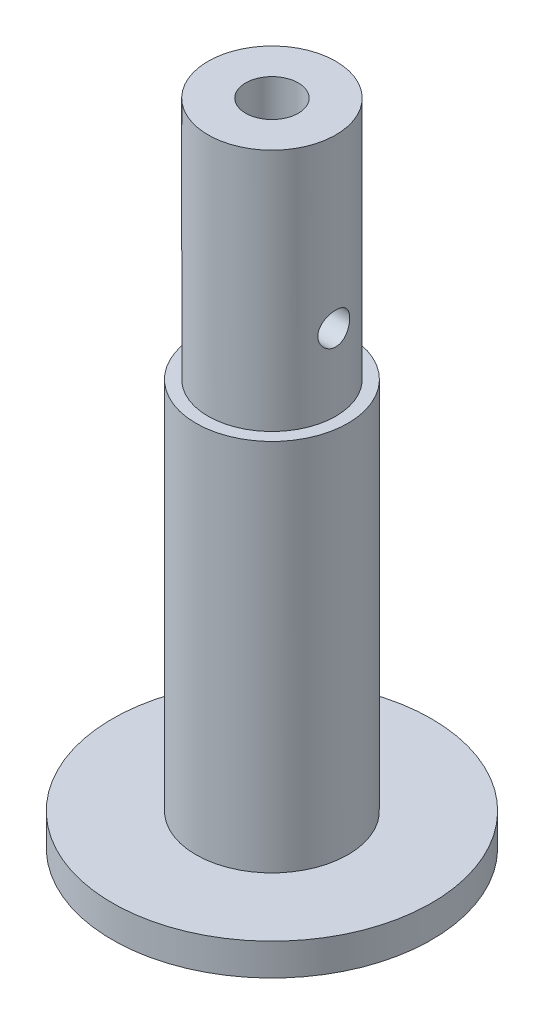
ISO-10303-21;
HEADER;
FILE_DESCRIPTION(('STEP AP214'),'2;1');
FILE_NAME('part.step','',(''),(''),'','','');
FILE_SCHEMA(('AUTOMOTIVE_DESIGN { 1 0 10303 214 1 1 1 1 }'));
ENDSEC;
DATA;
#1=APPLICATION_CONTEXT('core data for automotive mechanical design processes');
#2=APPLICATION_PROTOCOL_DEFINITION('international standard','automotive_design',2000,#1);
#3=PRODUCT_CONTEXT('',#1,'mechanical');
#4=PRODUCT('Part','Part','',(#3));
#5=PRODUCT_RELATED_PRODUCT_CATEGORY('part','',(#4));
#6=PRODUCT_DEFINITION_FORMATION('','',#4);
#7=PRODUCT_DEFINITION_CONTEXT('part definition',#1,'design');
#8=PRODUCT_DEFINITION('design','',#6,#7);
#9=PRODUCT_DEFINITION_SHAPE('','',#8);
#10=(LENGTH_UNIT() NAMED_UNIT(*) SI_UNIT(.MILLI.,.METRE.));
#11=(NAMED_UNIT(*) PLANE_ANGLE_UNIT() SI_UNIT($,.RADIAN.));
#12=(NAMED_UNIT(*) SI_UNIT($,.STERADIAN.) SOLID_ANGLE_UNIT());
#13=UNCERTAINTY_MEASURE_WITH_UNIT(LENGTH_MEASURE(1.E-05),#10,'distance_accuracy_value','');
#14=(GEOMETRIC_REPRESENTATION_CONTEXT(3) GLOBAL_UNCERTAINTY_ASSIGNED_CONTEXT((#13)) GLOBAL_UNIT_ASSIGNED_CONTEXT((#10,
#11,#12)) REPRESENTATION_CONTEXT('',''));
#15=CARTESIAN_POINT('',(0.,0.,0.));
#16=DIRECTION('',(0.,0.,1.));
#17=DIRECTION('',(1.,0.,0.));
#18=AXIS2_PLACEMENT_3D('',#15,#16,#17);
#19=CARTESIAN_POINT('',(0.,11.3137085018132,0.));
#20=DIRECTION('',(0.,-1.,0.));
#21=DIRECTION('',(0.,0.,-1.));
#22=AXIS2_PLACEMENT_3D('',#19,#20,#21);
#23=CYLINDRICAL_SURFACE('',#22,4.000000001);
#24=CARTESIAN_POINT('',(-3.87298334724022,-10.499999828,-0.999999999999989));
#25=CARTESIAN_POINT('',(-3.87298440160465,-10.4447795276427,-0.999998431438687));
#26=CARTESIAN_POINT('',(-3.87417722602529,-10.3895418685677,-0.995410498207978));
#27=CARTESIAN_POINT('',(-3.87880744995384,-10.2806527967654,-0.977209250194022));
#28=CARTESIAN_POINT('',(-3.88224615577231,-10.2270023262176,-0.963590682697397));
#29=CARTESIAN_POINT('',(-3.89095489915848,-10.1228784127087,-0.927796479848235));
#30=CARTESIAN_POINT('',(-3.89622257172067,-10.0724009658382,-0.905631891139077));
#31=CARTESIAN_POINT('',(-3.90799276920747,-9.97587548698258,-0.8534084565024));
#32=CARTESIAN_POINT('',(-3.91449534655503,-9.92982764316349,-0.823349275420825));
#33=CARTESIAN_POINT('',(-3.92816286642291,-9.84245516988856,-0.755483370919641));
#34=CARTESIAN_POINT('',(-3.9353383915045,-9.80124238785426,-0.717534755076227));
#35=CARTESIAN_POINT('',(-3.94945150308002,-9.72569527025102,-0.635272825634104));
#36=CARTESIAN_POINT('',(-3.95638906727893,-9.69136157774651,-0.590958917665476));
#37=CARTESIAN_POINT('',(-3.96936166308956,-9.63008964094339,-0.496458080424451));
#38=CARTESIAN_POINT('',(-3.97538275060898,-9.60326127273191,-0.446197830470959));
#39=CARTESIAN_POINT('',(-3.98572324870847,-9.55847597033634,-0.341705273710269));
#40=CARTESIAN_POINT('',(-3.99004291034044,-9.54051772723185,-0.287473554310151));
#41=CARTESIAN_POINT('',(-3.99641903639382,-9.51434069416738,-0.17774350349508));
#42=CARTESIAN_POINT('',(-3.99851957637781,-9.50593197026854,-0.122293087812811));
#43=CARTESIAN_POINT('',(-4.00037437742915,-9.49849647628971,-0.0107315276980221));
#44=CARTESIAN_POINT('',(-4.00012898538671,-9.4994683191165,0.0453795178224247));
#45=CARTESIAN_POINT('',(-3.99735238081449,-9.51062976810129,0.155352247180374));
#46=CARTESIAN_POINT('',(-3.99487201036433,-9.52061435802336,0.209236215609722));
#47=CARTESIAN_POINT('',(-3.98796334710166,-9.54918833602265,0.314538247423582));
#48=CARTESIAN_POINT('',(-3.98353495059694,-9.56777818215504,0.365956179380907));
#49=CARTESIAN_POINT('',(-3.97315003980902,-9.61320085628073,0.465406703513109));
#50=CARTESIAN_POINT('',(-3.96718007978699,-9.64010664587158,0.513404509778079));
#51=CARTESIAN_POINT('',(-3.95435961624832,-9.70134209965549,0.604275622352412));
#52=CARTESIAN_POINT('',(-3.94750895962129,-9.73567305543437,0.647148035097505));
#53=CARTESIAN_POINT('',(-3.93345485609289,-9.81188332480498,0.727774035096312));
#54=CARTESIAN_POINT('',(-3.92624687912036,-9.85394178495182,0.765357679085912));
#55=CARTESIAN_POINT('',(-3.91246017508721,-9.94383981743004,0.832976375972309));
#56=CARTESIAN_POINT('',(-3.90588147744609,-9.99167965981088,0.863011076054529));
#57=CARTESIAN_POINT('',(-3.89408198835221,-10.0921158416747,0.914788129029318));
#58=CARTESIAN_POINT('',(-3.88886793593007,-10.1447341201405,0.936489566976235));
#59=CARTESIAN_POINT('',(-3.88047456158967,-10.2530340152457,0.970685620640166));
#60=CARTESIAN_POINT('',(-3.87729480427179,-10.3087149736082,0.983182206555792));
#61=CARTESIAN_POINT('',(-3.87342142518893,-10.4199836286244,0.998331855467294));
#62=CARTESIAN_POINT('',(-3.87266435740737,-10.4755349453474,1.00123618956824));
#63=CARTESIAN_POINT('',(-3.87354937495716,-10.5863286026474,0.997806796204831));
#64=CARTESIAN_POINT('',(-3.87519123943787,-10.6415709711968,0.991473919137196));
#65=CARTESIAN_POINT('',(-3.8806283288501,-10.7492455339991,0.969970185570685));
#66=CARTESIAN_POINT('',(-3.88438788196864,-10.8017089186462,0.954945627307111));
#67=CARTESIAN_POINT('',(-3.89360287411312,-10.9033724111595,0.916647232659992));
#68=CARTESIAN_POINT('',(-3.89905851402258,-10.9525721316414,0.8933724190753));
#69=CARTESIAN_POINT('',(-3.91118454939848,-11.0473763391664,0.838708267161965));
#70=CARTESIAN_POINT('',(-3.91787667545044,-11.0928913640364,0.807168701520178));
#71=CARTESIAN_POINT('',(-3.93166833330743,-11.178075173139,0.737060292917511));
#72=CARTESIAN_POINT('',(-3.9387679319327,-11.217742994678,0.698490294787039));
#73=CARTESIAN_POINT('',(-3.95278961314159,-11.2911242450445,0.614262720964004));
#74=CARTESIAN_POINT('',(-3.95970280926061,-11.3246638530343,0.568451952510095));
#75=CARTESIAN_POINT('',(-3.9723888674646,-11.3835741747926,0.471702682671914));
#76=CARTESIAN_POINT('',(-3.97816178902379,-11.408945314654,0.420764448934343));
#77=CARTESIAN_POINT('',(-3.9878804639582,-11.4505782418191,0.315558201707131));
#78=CARTESIAN_POINT('',(-3.99183932109327,-11.4669055417581,0.261317381003692));
#79=CARTESIAN_POINT('',(-3.99754117458469,-11.4901839618471,0.15074976029447));
#80=CARTESIAN_POINT('',(-3.99928459857438,-11.4971368914979,0.0944233650169877));
#81=CARTESIAN_POINT('',(-4.00034169508793,-11.5013674175751,-0.0170835264679137));
#82=CARTESIAN_POINT('',(-3.99971978979971,-11.4989015370936,-0.0722538269910462));
#83=CARTESIAN_POINT('',(-3.99625896557401,-11.484952000701,-0.181367496440375));
#84=CARTESIAN_POINT('',(-3.99342011257107,-11.4734686129807,-0.235310901806719));
#85=CARTESIAN_POINT('',(-3.98585432954094,-11.4419476082196,-0.340171035671088));
#86=CARTESIAN_POINT('',(-3.98113764602882,-11.4219563746742,-0.391102494607521));
#87=CARTESIAN_POINT('',(-3.97031289013801,-11.3740292489658,-0.488917053068129));
#88=CARTESIAN_POINT('',(-3.9642046423827,-11.3460923553136,-0.535799641291641));
#89=CARTESIAN_POINT('',(-3.95107249782174,-11.2822845939825,-0.625401928449533));
#90=CARTESIAN_POINT('',(-3.94403017046645,-11.2462396850705,-0.667994988325378));
#91=CARTESIAN_POINT('',(-3.92990649154556,-11.1675769760007,-0.746615020294044));
#92=CARTESIAN_POINT('',(-3.92282513053958,-11.124957511875,-0.782640325089814));
#93=CARTESIAN_POINT('',(-3.90927475962599,-11.0333984137691,-0.847762026497821));
#94=CARTESIAN_POINT('',(-3.90281963832503,-10.9843557045571,-0.87671661946336));
#95=CARTESIAN_POINT('',(-3.89143955652588,-10.8819443380455,-0.925926896628646));
#96=CARTESIAN_POINT('',(-3.88651348347463,-10.8285788618607,-0.946188909770654));
#97=CARTESIAN_POINT('',(-3.87951908844264,-10.7294228161464,-0.974422528571738));
#98=CARTESIAN_POINT('',(-3.87708663108833,-10.6841066635955,-0.983993170599689));
#99=CARTESIAN_POINT('',(-3.87381838683595,-10.5925309589873,-0.996782292573592));
#100=CARTESIAN_POINT('',(-3.87298246373919,-10.5462714877438,-1.00000131437051));
#101=CARTESIAN_POINT('',(-3.87298334724022,-10.499999828,-0.999999999999989));
#102=B_SPLINE_CURVE_WITH_KNOTS('',3,(#24,#25,#26,#27,#28,#29,#30,#31,#32,#33,#34,#35,#36,#37,
#38,#39,#40,#41,#42,#43,#44,#45,#46,#47,#48,#49,#50,#51,#52,#53,#54,#55,#56,#57,#58,#59,#60,#61,
#62,#63,#64,#65,#66,#67,#68,#69,#70,#71,#72,#73,#74,#75,#76,#77,#78,#79,#80,#81,#82,#83,#84,#85,
#86,#87,#88,#89,#90,#91,#92,#93,#94,#95,#96,#97,#98,#99,#100,#101),.UNSPECIFIED.,.T.,.F.,(4,2,2,
2,2,2,2,2,2,2,2,2,2,2,2,2,2,2,2,2,2,2,2,2,2,2,2,2,2,2,2,2,2,2,2,2,2,2,4),(0.,0.165490976676687,
0.331078296537178,0.496452290833696,0.661833306990754,0.830495816740677,0.999174085888168,
1.17020598555905,1.34121263935443,1.50875500394781,1.67627259463088,1.8400730507248,
2.00388222687037,2.16917149699068,2.33448954185021,2.50428186626172,2.67408212477279,
2.84470572800593,3.01529280048927,3.1813742990189,3.34744050870821,3.51078962001245,
3.67415808566392,3.84073138341612,4.0073320755209,4.17810132384094,4.34886166285682,
4.51836829120551,4.68784219561315,4.85273378448829,5.01762046948786,5.18161950622109,
5.34563922293685,5.51358838631354,5.68158012624799,5.85270590912339,6.02370688544984,
6.16239130867586,6.30106390034782),.UNSPECIFIED.);
#103=CARTESIAN_POINT('',(-3.87298334724022,-10.499999828,-0.999999999999989));
#104=VERTEX_POINT('',#103);
#105=EDGE_CURVE('E41',#104,#104,#102,.T.);
#106=ORIENTED_EDGE('',*,*,#105,.T.);
#107=EDGE_LOOP('',(#106));
#108=FACE_BOUND('',#107,.T.);
#109=CARTESIAN_POINT('',(3.87298334724022,-10.499999828,-0.999999999999989));
#110=CARTESIAN_POINT('',(3.87298440160465,-10.5552201283573,-0.999998431438687));
#111=CARTESIAN_POINT('',(3.87417722602529,-10.6104577874323,-0.995410498207978));
#112=CARTESIAN_POINT('',(3.87880744995384,-10.7193468592346,-0.977209250194023));
#113=CARTESIAN_POINT('',(3.88224615577231,-10.7729973297824,-0.963590682697397));
#114=CARTESIAN_POINT('',(3.89095489915848,-10.8771212432913,-0.927796479848235));
#115=CARTESIAN_POINT('',(3.89622257172067,-10.9275986901618,-0.905631891139076));
#116=CARTESIAN_POINT('',(3.90799276920747,-11.0241241690174,-0.853408456502399));
#117=CARTESIAN_POINT('',(3.91449534655503,-11.0701720128365,-0.823349275420825));
#118=CARTESIAN_POINT('',(3.92816286642291,-11.1575444861115,-0.755483370919641));
#119=CARTESIAN_POINT('',(3.9353383915045,-11.1987572681458,-0.717534755076226));
#120=CARTESIAN_POINT('',(3.94945150308002,-11.274304385749,-0.635272825634102));
#121=CARTESIAN_POINT('',(3.95638906727893,-11.3086380782535,-0.590958917665474));
#122=CARTESIAN_POINT('',(3.96936166308956,-11.3699100150566,-0.496458080424449));
#123=CARTESIAN_POINT('',(3.97538275060898,-11.3967383832681,-0.446197830470958));
#124=CARTESIAN_POINT('',(3.98572324870847,-11.4415236856637,-0.341705273710268));
#125=CARTESIAN_POINT('',(3.99004291034044,-11.4594819287682,-0.28747355431015));
#126=CARTESIAN_POINT('',(3.99641903639382,-11.4856589618326,-0.17774350349508));
#127=CARTESIAN_POINT('',(3.99851957637781,-11.4940676857315,-0.122293087812811));
#128=CARTESIAN_POINT('',(4.00037437742915,-11.5015031797103,-0.0107315276980221));
#129=CARTESIAN_POINT('',(4.00012898538671,-11.5005313368835,0.0453795178224247));
#130=CARTESIAN_POINT('',(3.99735238081449,-11.4893698878987,0.155352247180374));
#131=CARTESIAN_POINT('',(3.99487201036433,-11.4793852979766,0.209236215609722));
#132=CARTESIAN_POINT('',(3.98796334710166,-11.4508113199774,0.314538247423582));
#133=CARTESIAN_POINT('',(3.98353495059694,-11.432221473845,0.365956179380907));
#134=CARTESIAN_POINT('',(3.97315003980902,-11.3867987997193,0.465406703513108));
#135=CARTESIAN_POINT('',(3.96718007978699,-11.3598930101284,0.513404509778078));
#136=CARTESIAN_POINT('',(3.95435961624832,-11.2986575563445,0.604275622352412));
#137=CARTESIAN_POINT('',(3.94750895962129,-11.2643266005656,0.647148035097506));
#138=CARTESIAN_POINT('',(3.93345485609289,-11.188116331195,0.727774035096313));
#139=CARTESIAN_POINT('',(3.92624687912036,-11.1460578710482,0.765357679085912));
#140=CARTESIAN_POINT('',(3.91246017508721,-11.05615983857,0.832976375972308));
#141=CARTESIAN_POINT('',(3.90588147744609,-11.0083199961891,0.863011076054528));
#142=CARTESIAN_POINT('',(3.89408198835221,-10.9078838143253,0.914788129029318));
#143=CARTESIAN_POINT('',(3.88886793593007,-10.8552655358595,0.936489566976235));
#144=CARTESIAN_POINT('',(3.88047456158967,-10.7469656407543,0.970685620640166));
#145=CARTESIAN_POINT('',(3.87729480427179,-10.6912846823918,0.983182206555792));
#146=CARTESIAN_POINT('',(3.87342142518892,-10.5800160273756,0.998331855467294));
#147=CARTESIAN_POINT('',(3.87266435740737,-10.5244647106526,1.00123618956824));
#148=CARTESIAN_POINT('',(3.87354937495716,-10.4136710533526,0.997806796204831));
#149=CARTESIAN_POINT('',(3.87519123943787,-10.3584286848032,0.991473919137196));
#150=CARTESIAN_POINT('',(3.8806283288501,-10.2507541220009,0.969970185570685));
#151=CARTESIAN_POINT('',(3.88438788196864,-10.1982907373538,0.954945627307111));
#152=CARTESIAN_POINT('',(3.89360287411313,-10.0966272448405,0.916647232659992));
#153=CARTESIAN_POINT('',(3.89905851402258,-10.0474275243586,0.893372419075299));
#154=CARTESIAN_POINT('',(3.91118454939848,-9.95262331683363,0.838708267161965));
#155=CARTESIAN_POINT('',(3.91787667545044,-9.90710829196357,0.807168701520179));
#156=CARTESIAN_POINT('',(3.93166833330743,-9.82192448286101,0.737060292917511));
#157=CARTESIAN_POINT('',(3.9387679319327,-9.78225666132204,0.698490294787038));
#158=CARTESIAN_POINT('',(3.95278961314159,-9.70887541095556,0.614262720964005));
#159=CARTESIAN_POINT('',(3.95970280926061,-9.67533580296569,0.568451952510096));
#160=CARTESIAN_POINT('',(3.9723888674646,-9.61642548120738,0.471702682671916));
#161=CARTESIAN_POINT('',(3.97816178902379,-9.59105434134599,0.420764448934344));
#162=CARTESIAN_POINT('',(3.9878804639582,-9.5494214141809,0.315558201707132));
#163=CARTESIAN_POINT('',(3.99183932109327,-9.53309411424187,0.261317381003692));
#164=CARTESIAN_POINT('',(3.99754117458469,-9.50981569415296,0.15074976029447));
#165=CARTESIAN_POINT('',(3.99928459857438,-9.50286276450211,0.0944233650169875));
#166=CARTESIAN_POINT('',(4.00034169508793,-9.49863223842488,-0.017083526467914));
#167=CARTESIAN_POINT('',(3.99971978979971,-9.50109811890641,-0.0722538269910464));
#168=CARTESIAN_POINT('',(3.99625896557401,-9.51504765529904,-0.181367496440375));
#169=CARTESIAN_POINT('',(3.99342011257107,-9.52653104301933,-0.23531090180672));
#170=CARTESIAN_POINT('',(3.98585432954094,-9.55805204778038,-0.340171035671088));
#171=CARTESIAN_POINT('',(3.98113764602882,-9.57804328132583,-0.39110249460752));
#172=CARTESIAN_POINT('',(3.97031289013801,-9.6259704070342,-0.488917053068128));
#173=CARTESIAN_POINT('',(3.9642046423827,-9.65390730068637,-0.535799641291641));
#174=CARTESIAN_POINT('',(3.95107249782174,-9.71771506201755,-0.625401928449534));
#175=CARTESIAN_POINT('',(3.94403017046645,-9.75375997092954,-0.667994988325379));
#176=CARTESIAN_POINT('',(3.92990649154556,-9.83242267999928,-0.746615020294045));
#177=CARTESIAN_POINT('',(3.92282513053958,-9.87504214412502,-0.782640325089815));
#178=CARTESIAN_POINT('',(3.90927475962599,-9.96660124223087,-0.847762026497821));
#179=CARTESIAN_POINT('',(3.90281963832503,-10.0156439514429,-0.87671661946336));
#180=CARTESIAN_POINT('',(3.89143955652588,-10.1180553179545,-0.925926896628646));
#181=CARTESIAN_POINT('',(3.88651348347463,-10.1714207941393,-0.946188909770654));
#182=CARTESIAN_POINT('',(3.87951908844264,-10.2705768398536,-0.974422528571738));
#183=CARTESIAN_POINT('',(3.87708663108833,-10.3158929924045,-0.983993170599689));
#184=CARTESIAN_POINT('',(3.87381838683595,-10.4074686970127,-0.996782292573592));
#185=CARTESIAN_POINT('',(3.87298246373919,-10.4537281682562,-1.00000131437051));
#186=CARTESIAN_POINT('',(3.87298334724022,-10.499999828,-0.999999999999989));
#187=B_SPLINE_CURVE_WITH_KNOTS('',3,(#109,#110,#111,#112,#113,#114,#115,#116,#117,#118,#119,
#120,#121,#122,#123,#124,#125,#126,#127,#128,#129,#130,#131,#132,#133,#134,#135,#136,#137,#138,
#139,#140,#141,#142,#143,#144,#145,#146,#147,#148,#149,#150,#151,#152,#153,#154,#155,#156,#157,
#158,#159,#160,#161,#162,#163,#164,#165,#166,#167,#168,#169,#170,#171,#172,#173,#174,#175,#176,
#177,#178,#179,#180,#181,#182,#183,#184,#185,#186),.UNSPECIFIED.,.T.,.F.,(4,2,2,2,2,2,2,2,2,2,2,
2,2,2,2,2,2,2,2,2,2,2,2,2,2,2,2,2,2,2,2,2,2,2,2,2,2,2,4),(0.,0.165490976676687,
0.331078296537178,0.496452290833694,0.661833306990754,0.830495816740679,0.999174085888169,
1.17020598555905,1.34121263935443,1.50875500394781,1.67627259463088,1.8400730507248,
2.00388222687037,2.16917149699068,2.33448954185021,2.50428186626172,2.67408212477278,
2.84470572800592,3.01529280048927,3.1813742990189,3.34744050870821,3.51078962001245,
3.67415808566391,3.84073138341612,4.0073320755209,4.17810132384093,4.34886166285682,
4.5183682912055,4.68784219561314,4.85273378448829,5.01762046948786,5.18161950622109,
5.34563922293684,5.51358838631354,5.68158012624799,5.85270590912339,6.02370688544984,
6.16239130867586,6.30106390034782),.UNSPECIFIED.);
#188=CARTESIAN_POINT('',(3.87298334724022,-10.499999828,-0.999999999999989));
#189=VERTEX_POINT('',#188);
#190=EDGE_CURVE('E11',#189,#189,#187,.T.);
#191=ORIENTED_EDGE('',*,*,#190,.T.);
#192=EDGE_LOOP('',(#191));
#193=FACE_BOUND('',#192,.T.);
#194=CARTESIAN_POINT('',(0.,0.,0.));
#195=DIRECTION('',(0.,-1.,0.));
#196=DIRECTION('',(0.,0.,-1.));
#197=AXIS2_PLACEMENT_3D('',#194,#195,#196);
#198=CIRCLE('',#197,4.000000001);
#199=CARTESIAN_POINT('',(0.,0.,-4.000000001));
#200=VERTEX_POINT('',#199);
#201=EDGE_CURVE('E48',#200,#200,#198,.T.);
#202=ORIENTED_EDGE('',*,*,#201,.T.);
#203=EDGE_LOOP('',(#202));
#204=FACE_BOUND('',#203,.T.);
#205=CARTESIAN_POINT('',(0.,-15.264999934,0.));
#206=DIRECTION('',(0.,1.,0.));
#207=DIRECTION('',(0.,0.,1.));
#208=AXIS2_PLACEMENT_3D('',#205,#206,#207);
#209=CIRCLE('',#208,4.000000001);
#210=CARTESIAN_POINT('',(0.,-15.264999934,4.000000001));
#211=VERTEX_POINT('',#210);
#212=EDGE_CURVE('E65',#211,#211,#209,.T.);
#213=ORIENTED_EDGE('',*,*,#212,.T.);
#214=EDGE_LOOP('',(#213));
#215=FACE_BOUND('',#214,.T.);
#216=ADVANCED_FACE('F37',(#108,#193,#204,#215),#23,.T.);
#217=CARTESIAN_POINT('',(0.,0.,0.));
#218=DIRECTION('',(0.,-1.,0.));
#219=DIRECTION('',(0.,0.,-1.));
#220=AXIS2_PLACEMENT_3D('',#217,#218,#219);
#221=PLANE('',#220);
#222=CARTESIAN_POINT('',(0.,0.,0.));
#223=DIRECTION('',(0.,1.,0.));
#224=DIRECTION('',(0.,0.,1.));
#225=AXIS2_PLACEMENT_3D('',#222,#223,#224);
#226=CIRCLE('',#225,1.64999999999999);
#227=CARTESIAN_POINT('',(0.,0.,1.64999999999999));
#228=VERTEX_POINT('',#227);
#229=EDGE_CURVE('E61',#228,#228,#226,.T.);
#230=ORIENTED_EDGE('',*,*,#229,.F.);
#231=EDGE_LOOP('',(#230));
#232=FACE_BOUND('',#231,.T.);
#233=ORIENTED_EDGE('',*,*,#201,.F.);
#234=EDGE_LOOP('',(#233));
#235=FACE_BOUND('',#234,.T.);
#236=ADVANCED_FACE('F74',(#232,#235),#221,.F.);
#237=CARTESIAN_POINT('',(4.000000001,-10.499999828,0.));
#238=DIRECTION('',(1.,0.,0.));
#239=DIRECTION('',(0.,0.,-1.));
#240=AXIS2_PLACEMENT_3D('',#237,#238,#239);
#241=CYLINDRICAL_SURFACE('',#240,0.999999999999989);
#242=ORIENTED_EDGE('',*,*,#190,.F.);
#243=EDGE_LOOP('',(#242));
#244=FACE_BOUND('',#243,.T.);
#245=ORIENTED_EDGE('',*,*,#105,.F.);
#246=EDGE_LOOP('',(#245));
#247=FACE_BOUND('',#246,.T.);
#248=ADVANCED_FACE('F55',(#244,#247),#241,.F.);
#249=CARTESIAN_POINT('',(0.,-7.00000378000001,0.));
#250=DIRECTION('',(0.,1.,0.));
#251=DIRECTION('',(0.,0.,1.));
#252=AXIS2_PLACEMENT_3D('',#249,#250,#251);
#253=CONICAL_SURFACE('',#252,1.64999999999998,1.02974425867665);
#254=CARTESIAN_POINT('',(0.,-7.99142380139548,0.));
#255=VERTEX_POINT('',#254);
#256=VERTEX_LOOP('',#255);
#257=FACE_BOUND('',#256,.T.);
#258=CARTESIAN_POINT('',(0.,-7.00000378000001,0.));
#259=DIRECTION('',(0.,1.,0.));
#260=DIRECTION('',(0.,0.,1.));
#261=AXIS2_PLACEMENT_3D('',#258,#259,#260);
#262=CIRCLE('',#261,1.64999999999998);
#263=CARTESIAN_POINT('',(0.,-7.00000378000001,1.64999999999998));
#264=VERTEX_POINT('',#263);
#265=EDGE_CURVE('E59',#264,#264,#262,.T.);
#266=ORIENTED_EDGE('',*,*,#265,.T.);
#267=EDGE_LOOP('',(#266));
#268=FACE_BOUND('',#267,.T.);
#269=ADVANCED_FACE('F51',(#257,#268),#253,.F.);
#270=CARTESIAN_POINT('',(0.,0.,0.));
#271=DIRECTION('',(0.,1.,0.));
#272=DIRECTION('',(0.,0.,1.));
#273=AXIS2_PLACEMENT_3D('',#270,#271,#272);
#274=CYLINDRICAL_SURFACE('',#273,1.64999999999998);
#275=ORIENTED_EDGE('',*,*,#265,.F.);
#276=EDGE_LOOP('',(#275));
#277=FACE_BOUND('',#276,.T.);
#278=ORIENTED_EDGE('',*,*,#229,.T.);
#279=EDGE_LOOP('',(#278));
#280=FACE_BOUND('',#279,.T.);
#281=ADVANCED_FACE('F54',(#277,#280),#274,.F.);
#282=CARTESIAN_POINT('',(0.,-52.1475841156037,0.));
#283=DIRECTION('',(0.,1.,0.));
#284=DIRECTION('',(0.,0.,1.));
#285=AXIS2_PLACEMENT_3D('',#282,#283,#284);
#286=CYLINDRICAL_SURFACE('',#285,4.7625);
#287=CARTESIAN_POINT('',(0.,-38.677199934,0.));
#288=DIRECTION('',(0.,-1.,0.));
#289=DIRECTION('',(0.,0.,-1.));
#290=AXIS2_PLACEMENT_3D('',#287,#288,#289);
#291=CIRCLE('',#290,4.7625);
#292=CARTESIAN_POINT('',(0.,-38.677199934,-4.7625));
#293=VERTEX_POINT('',#292);
#294=EDGE_CURVE('E92',#293,#293,#291,.F.);
#295=ORIENTED_EDGE('',*,*,#294,.T.);
#296=EDGE_LOOP('',(#295));
#297=FACE_BOUND('',#296,.T.);
#298=CARTESIAN_POINT('',(0.,-15.264999934,0.));
#299=DIRECTION('',(0.,1.,0.));
#300=DIRECTION('',(0.,0.,1.));
#301=AXIS2_PLACEMENT_3D('',#298,#299,#300);
#302=CIRCLE('',#301,4.7625);
#303=CARTESIAN_POINT('',(0.,-15.264999934,4.7625));
#304=VERTEX_POINT('',#303);
#305=EDGE_CURVE('E102',#304,#304,#302,.T.);
#306=ORIENTED_EDGE('',*,*,#305,.F.);
#307=EDGE_LOOP('',(#306));
#308=FACE_BOUND('',#307,.T.);
#309=ADVANCED_FACE('F108',(#297,#308),#286,.T.);
#310=CARTESIAN_POINT('',(0.,-68.9614711814619,0.));
#311=DIRECTION('',(0.,1.,0.));
#312=DIRECTION('',(0.,0.,1.));
#313=AXIS2_PLACEMENT_3D('',#310,#311,#312);
#314=CYLINDRICAL_SURFACE('',#313,10.);
#315=CARTESIAN_POINT('',(0.,-38.677199934,0.));
#316=DIRECTION('',(0.,-1.,0.));
#317=DIRECTION('',(0.,0.,-1.));
#318=AXIS2_PLACEMENT_3D('',#315,#316,#317);
#319=CIRCLE('',#318,10.);
#320=CARTESIAN_POINT('',(0.,-38.677199934,-10.));
#321=VERTEX_POINT('',#320);
#322=EDGE_CURVE('E99',#321,#321,#319,.T.);
#323=ORIENTED_EDGE('',*,*,#322,.T.);
#324=EDGE_LOOP('',(#323));
#325=FACE_BOUND('',#324,.T.);
#326=CARTESIAN_POINT('',(0.,-40.677199934,0.));
#327=DIRECTION('',(0.,-1.,0.));
#328=DIRECTION('',(0.,0.,-1.));
#329=AXIS2_PLACEMENT_3D('',#326,#327,#328);
#330=CIRCLE('',#329,10.);
#331=CARTESIAN_POINT('',(0.,-40.677199934,-10.));
#332=VERTEX_POINT('',#331);
#333=EDGE_CURVE('E94',#332,#332,#330,.T.);
#334=ORIENTED_EDGE('',*,*,#333,.F.);
#335=EDGE_LOOP('',(#334));
#336=FACE_BOUND('',#335,.T.);
#337=ADVANCED_FACE('F110',(#325,#336),#314,.T.);
#338=CARTESIAN_POINT('',(0.,-38.677199934,0.));
#339=DIRECTION('',(0.,-1.,0.));
#340=DIRECTION('',(0.,0.,-1.));
#341=AXIS2_PLACEMENT_3D('',#338,#339,#340);
#342=PLANE('',#341);
#343=ORIENTED_EDGE('',*,*,#294,.F.);
#344=EDGE_LOOP('',(#343));
#345=FACE_BOUND('',#344,.T.);
#346=ORIENTED_EDGE('',*,*,#322,.F.);
#347=EDGE_LOOP('',(#346));
#348=FACE_BOUND('',#347,.T.);
#349=ADVANCED_FACE('F117',(#345,#348),#342,.F.);
#350=CARTESIAN_POINT('',(0.,-40.677199934,0.));
#351=DIRECTION('',(0.,-1.,0.));
#352=DIRECTION('',(0.,0.,-1.));
#353=AXIS2_PLACEMENT_3D('',#350,#351,#352);
#354=PLANE('',#353);
#355=ORIENTED_EDGE('',*,*,#333,.T.);
#356=EDGE_LOOP('',(#355));
#357=FACE_BOUND('',#356,.T.);
#358=ADVANCED_FACE('F121',(#357),#354,.T.);
#359=CARTESIAN_POINT('',(0.,-15.264999934,0.));
#360=DIRECTION('',(0.,1.,0.));
#361=DIRECTION('',(0.,0.,1.));
#362=AXIS2_PLACEMENT_3D('',#359,#360,#361);
#363=PLANE('',#362);
#364=ORIENTED_EDGE('',*,*,#212,.F.);
#365=EDGE_LOOP('',(#364));
#366=FACE_BOUND('',#365,.T.);
#367=ORIENTED_EDGE('',*,*,#305,.T.);
#368=EDGE_LOOP('',(#367));
#369=FACE_BOUND('',#368,.T.);
#370=ADVANCED_FACE('F106',(#366,#369),#363,.T.);
#371=CLOSED_SHELL('',(#216,#236,#248,#269,#281,#309,#337,#349,#358,#370));
#372=MANIFOLD_SOLID_BREP('B2',#371);
#373=ADVANCED_BREP_SHAPE_REPRESENTATION('',(#18,#372),#14);
#374=SHAPE_DEFINITION_REPRESENTATION(#9,#373);
ENDSEC;
END-ISO-10303-21;
